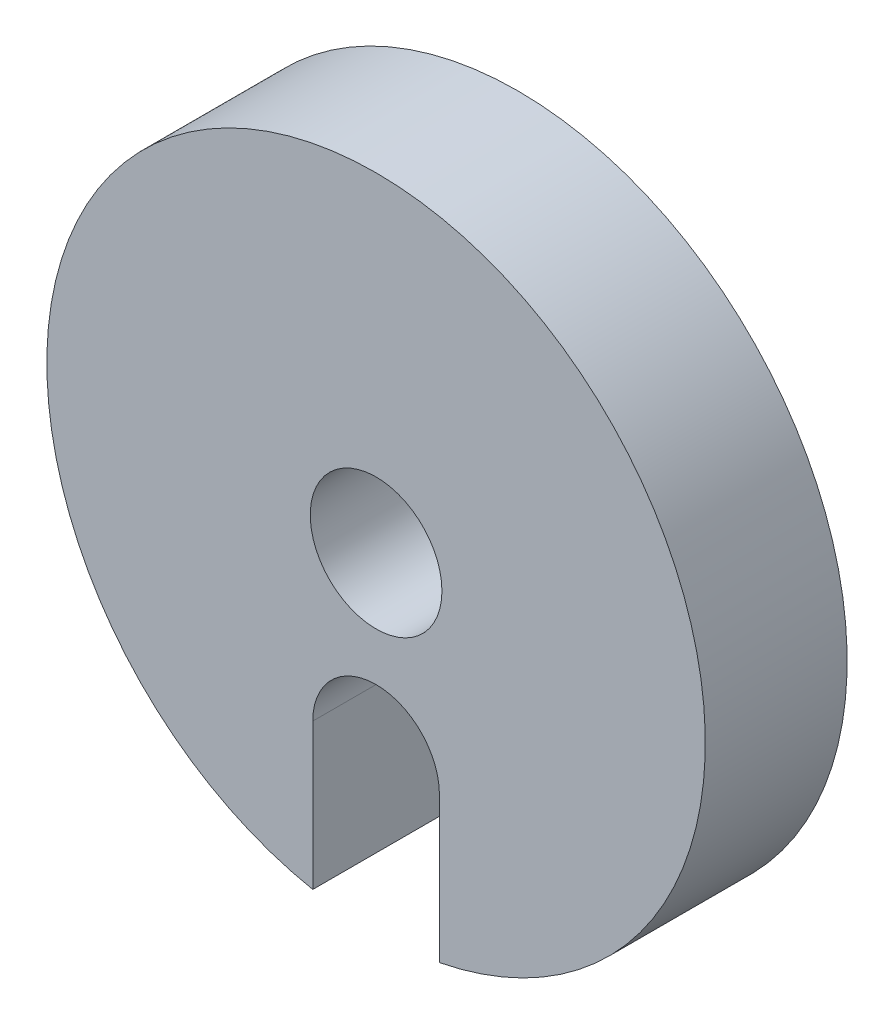
ISO-10303-21;
HEADER;
FILE_DESCRIPTION(('STEP AP214'),'2;1');
FILE_NAME('part.step','',(''),(''),'','','');
FILE_SCHEMA(('AUTOMOTIVE_DESIGN { 1 0 10303 214 1 1 1 1 }'));
ENDSEC;
DATA;
#1=APPLICATION_CONTEXT('core data for automotive mechanical design processes');
#2=APPLICATION_PROTOCOL_DEFINITION('international standard','automotive_design',2000,#1);
#3=PRODUCT_CONTEXT('',#1,'mechanical');
#4=PRODUCT('Part','Part','',(#3));
#5=PRODUCT_RELATED_PRODUCT_CATEGORY('part','',(#4));
#6=PRODUCT_DEFINITION_FORMATION('','',#4);
#7=PRODUCT_DEFINITION_CONTEXT('part definition',#1,'design');
#8=PRODUCT_DEFINITION('design','',#6,#7);
#9=PRODUCT_DEFINITION_SHAPE('','',#8);
#10=(LENGTH_UNIT() NAMED_UNIT(*) SI_UNIT(.MILLI.,.METRE.));
#11=(NAMED_UNIT(*) PLANE_ANGLE_UNIT() SI_UNIT($,.RADIAN.));
#12=(NAMED_UNIT(*) SI_UNIT($,.STERADIAN.) SOLID_ANGLE_UNIT());
#13=UNCERTAINTY_MEASURE_WITH_UNIT(LENGTH_MEASURE(1.E-05),#10,'distance_accuracy_value','');
#14=(GEOMETRIC_REPRESENTATION_CONTEXT(3) GLOBAL_UNCERTAINTY_ASSIGNED_CONTEXT((#13)) GLOBAL_UNIT_ASSIGNED_CONTEXT((#10,
#11,#12)) REPRESENTATION_CONTEXT('',''));
#15=CARTESIAN_POINT('',(0.,0.,0.));
#16=DIRECTION('',(0.,0.,1.));
#17=DIRECTION('',(1.,0.,0.));
#18=AXIS2_PLACEMENT_3D('',#15,#16,#17);
#19=CARTESIAN_POINT('',(0.,-7.,5.6));
#20=DIRECTION('',(0.,0.,-1.));
#21=DIRECTION('',(-1.,0.,0.));
#22=AXIS2_PLACEMENT_3D('',#19,#20,#21);
#23=CYLINDRICAL_SURFACE('',#22,2.5);
#24=CARTESIAN_POINT('',(0.,-7.,0.));
#25=DIRECTION('',(0.,0.,1.));
#26=DIRECTION('',(1.,0.,0.));
#27=AXIS2_PLACEMENT_3D('',#24,#25,#26);
#28=CIRCLE('',#27,2.5);
#29=CARTESIAN_POINT('',(2.5,-7.,0.));
#30=VERTEX_POINT('',#29);
#31=CARTESIAN_POINT('',(-2.5,-7.,0.));
#32=VERTEX_POINT('',#31);
#33=EDGE_CURVE('E104',#30,#32,#28,.T.);
#34=ORIENTED_EDGE('',*,*,#33,.F.);
#35=DIRECTION('',(0.,0.,-1.));
#36=VECTOR('',#35,1.);
#37=CARTESIAN_POINT('',(2.5,-7.,5.6));
#38=LINE('',#37,#36);
#39=CARTESIAN_POINT('',(2.5,-7.,5.6));
#40=VERTEX_POINT('',#39);
#41=EDGE_CURVE('E11',#40,#30,#38,.T.);
#42=ORIENTED_EDGE('',*,*,#41,.F.);
#43=CARTESIAN_POINT('',(0.,-7.,5.6));
#44=DIRECTION('',(0.,0.,1.));
#45=DIRECTION('',(1.,0.,0.));
#46=AXIS2_PLACEMENT_3D('',#43,#44,#45);
#47=CIRCLE('',#46,2.5);
#48=CARTESIAN_POINT('',(-2.5,-7.,5.6));
#49=VERTEX_POINT('',#48);
#50=EDGE_CURVE('E86',#40,#49,#47,.T.);
#51=ORIENTED_EDGE('',*,*,#50,.T.);
#52=DIRECTION('',(0.,0.,-1.));
#53=VECTOR('',#52,1.);
#54=CARTESIAN_POINT('',(-2.5,-7.,5.6));
#55=LINE('',#54,#53);
#56=EDGE_CURVE('E53',#49,#32,#55,.T.);
#57=ORIENTED_EDGE('',*,*,#56,.T.);
#58=EDGE_LOOP('',(#34,#42,#51,#57));
#59=FACE_BOUND('',#58,.T.);
#60=ADVANCED_FACE('F37',(#59),#23,.F.);
#61=CARTESIAN_POINT('',(2.5,0.,5.6));
#62=DIRECTION('',(1.,0.,0.));
#63=DIRECTION('',(0.,0.,-1.));
#64=AXIS2_PLACEMENT_3D('',#61,#62,#63);
#65=PLANE('',#64);
#66=DIRECTION('',(0.,-1.,0.));
#67=VECTOR('',#66,1.);
#68=CARTESIAN_POINT('',(2.5,0.,0.));
#69=LINE('',#68,#67);
#70=CARTESIAN_POINT('',(2.5,-12.7573508221731,0.));
#71=VERTEX_POINT('',#70);
#72=EDGE_CURVE('E92',#30,#71,#69,.T.);
#73=ORIENTED_EDGE('',*,*,#72,.T.);
#74=DIRECTION('',(0.,0.,-1.));
#75=VECTOR('',#74,1.);
#76=CARTESIAN_POINT('',(2.5,-12.7573508221731,5.6));
#77=LINE('',#76,#75);
#78=CARTESIAN_POINT('',(2.5,-12.7573508221731,5.6));
#79=VERTEX_POINT('',#78);
#80=EDGE_CURVE('E45',#79,#71,#77,.T.);
#81=ORIENTED_EDGE('',*,*,#80,.F.);
#82=DIRECTION('',(0.,-1.,0.));
#83=VECTOR('',#82,1.);
#84=CARTESIAN_POINT('',(2.5,0.,5.6));
#85=LINE('',#84,#83);
#86=EDGE_CURVE('E79',#40,#79,#85,.T.);
#87=ORIENTED_EDGE('',*,*,#86,.F.);
#88=ORIENTED_EDGE('',*,*,#41,.T.);
#89=EDGE_LOOP('',(#73,#81,#87,#88));
#90=FACE_BOUND('',#89,.T.);
#91=ADVANCED_FACE('F90',(#90),#65,.F.);
#92=CARTESIAN_POINT('',(0.,0.,5.6));
#93=DIRECTION('',(0.,0.,-1.));
#94=DIRECTION('',(-1.,0.,0.));
#95=AXIS2_PLACEMENT_3D('',#92,#93,#94);
#96=CYLINDRICAL_SURFACE('',#95,13.);
#97=CARTESIAN_POINT('',(0.,0.,0.));
#98=DIRECTION('',(0.,0.,1.));
#99=DIRECTION('',(1.,0.,0.));
#100=AXIS2_PLACEMENT_3D('',#97,#98,#99);
#101=CIRCLE('',#100,13.);
#102=CARTESIAN_POINT('',(-2.5,-12.7573508221731,0.));
#103=VERTEX_POINT('',#102);
#104=EDGE_CURVE('E107',#71,#103,#101,.T.);
#105=ORIENTED_EDGE('',*,*,#104,.T.);
#106=DIRECTION('',(0.,0.,-1.));
#107=VECTOR('',#106,1.);
#108=CARTESIAN_POINT('',(-2.5,-12.7573508221731,5.6));
#109=LINE('',#108,#107);
#110=CARTESIAN_POINT('',(-2.5,-12.7573508221731,5.6));
#111=VERTEX_POINT('',#110);
#112=EDGE_CURVE('E67',#111,#103,#109,.T.);
#113=ORIENTED_EDGE('',*,*,#112,.F.);
#114=CARTESIAN_POINT('',(0.,0.,5.6));
#115=DIRECTION('',(0.,0.,1.));
#116=DIRECTION('',(1.,0.,0.));
#117=AXIS2_PLACEMENT_3D('',#114,#115,#116);
#118=CIRCLE('',#117,13.);
#119=EDGE_CURVE('E85',#79,#111,#118,.T.);
#120=ORIENTED_EDGE('',*,*,#119,.F.);
#121=ORIENTED_EDGE('',*,*,#80,.T.);
#122=EDGE_LOOP('',(#105,#113,#120,#121));
#123=FACE_BOUND('',#122,.T.);
#124=ADVANCED_FACE('F95',(#123),#96,.T.);
#125=CARTESIAN_POINT('',(-2.5,0.,5.6));
#126=DIRECTION('',(1.,0.,0.));
#127=DIRECTION('',(0.,0.,-1.));
#128=AXIS2_PLACEMENT_3D('',#125,#126,#127);
#129=PLANE('',#128);
#130=DIRECTION('',(0.,-1.,0.));
#131=VECTOR('',#130,1.);
#132=CARTESIAN_POINT('',(-2.5,0.,0.));
#133=LINE('',#132,#131);
#134=EDGE_CURVE('E109',#32,#103,#133,.T.);
#135=ORIENTED_EDGE('',*,*,#134,.F.);
#136=ORIENTED_EDGE('',*,*,#56,.F.);
#137=DIRECTION('',(0.,-1.,0.));
#138=VECTOR('',#137,1.);
#139=CARTESIAN_POINT('',(-2.5,0.,5.6));
#140=LINE('',#139,#138);
#141=EDGE_CURVE('E96',#49,#111,#140,.T.);
#142=ORIENTED_EDGE('',*,*,#141,.T.);
#143=ORIENTED_EDGE('',*,*,#112,.T.);
#144=EDGE_LOOP('',(#135,#136,#142,#143));
#145=FACE_BOUND('',#144,.T.);
#146=ADVANCED_FACE('F118',(#145),#129,.T.);
#147=CARTESIAN_POINT('',(0.,0.,5.6));
#148=DIRECTION('',(0.,0.,-1.));
#149=DIRECTION('',(-1.,0.,0.));
#150=AXIS2_PLACEMENT_3D('',#147,#148,#149);
#151=CYLINDRICAL_SURFACE('',#150,2.6);
#152=CARTESIAN_POINT('',(0.,0.,5.6));
#153=DIRECTION('',(0.,0.,1.));
#154=DIRECTION('',(1.,0.,0.));
#155=AXIS2_PLACEMENT_3D('',#152,#153,#154);
#156=CIRCLE('',#155,2.6);
#157=CARTESIAN_POINT('',(2.6,0.,5.6));
#158=VERTEX_POINT('',#157);
#159=EDGE_CURVE('E98',#158,#158,#156,.T.);
#160=ORIENTED_EDGE('',*,*,#159,.T.);
#161=EDGE_LOOP('',(#160));
#162=FACE_BOUND('',#161,.T.);
#163=CARTESIAN_POINT('',(0.,0.,0.));
#164=DIRECTION('',(0.,0.,1.));
#165=DIRECTION('',(1.,0.,0.));
#166=AXIS2_PLACEMENT_3D('',#163,#164,#165);
#167=CIRCLE('',#166,2.6);
#168=CARTESIAN_POINT('',(2.6,0.,0.));
#169=VERTEX_POINT('',#168);
#170=EDGE_CURVE('E112',#169,#169,#167,.T.);
#171=ORIENTED_EDGE('',*,*,#170,.F.);
#172=EDGE_LOOP('',(#171));
#173=FACE_BOUND('',#172,.T.);
#174=ADVANCED_FACE('F120',(#162,#173),#151,.F.);
#175=CARTESIAN_POINT('',(0.,0.,5.6));
#176=DIRECTION('',(0.,0.,1.));
#177=DIRECTION('',(1.,0.,0.));
#178=AXIS2_PLACEMENT_3D('',#175,#176,#177);
#179=PLANE('',#178);
#180=ORIENTED_EDGE('',*,*,#50,.F.);
#181=ORIENTED_EDGE('',*,*,#86,.T.);
#182=ORIENTED_EDGE('',*,*,#119,.T.);
#183=ORIENTED_EDGE('',*,*,#141,.F.);
#184=EDGE_LOOP('',(#180,#181,#182,#183));
#185=FACE_BOUND('',#184,.T.);
#186=ORIENTED_EDGE('',*,*,#159,.F.);
#187=EDGE_LOOP('',(#186));
#188=FACE_BOUND('',#187,.T.);
#189=ADVANCED_FACE('F81',(#185,#188),#179,.T.);
#190=CARTESIAN_POINT('',(0.,0.,0.));
#191=DIRECTION('',(0.,0.,1.));
#192=DIRECTION('',(1.,0.,0.));
#193=AXIS2_PLACEMENT_3D('',#190,#191,#192);
#194=PLANE('',#193);
#195=ORIENTED_EDGE('',*,*,#33,.T.);
#196=ORIENTED_EDGE('',*,*,#134,.T.);
#197=ORIENTED_EDGE('',*,*,#104,.F.);
#198=ORIENTED_EDGE('',*,*,#72,.F.);
#199=EDGE_LOOP('',(#195,#196,#197,#198));
#200=FACE_BOUND('',#199,.T.);
#201=ORIENTED_EDGE('',*,*,#170,.T.);
#202=EDGE_LOOP('',(#201));
#203=FACE_BOUND('',#202,.T.);
#204=ADVANCED_FACE('F152',(#200,#203),#194,.F.);
#205=CLOSED_SHELL('',(#60,#91,#124,#146,#174,#189,#204));
#206=MANIFOLD_SOLID_BREP('B2',#205);
#207=ADVANCED_BREP_SHAPE_REPRESENTATION('',(#18,#206),#14);
#208=SHAPE_DEFINITION_REPRESENTATION(#9,#207);
ENDSEC;
END-ISO-10303-21;
